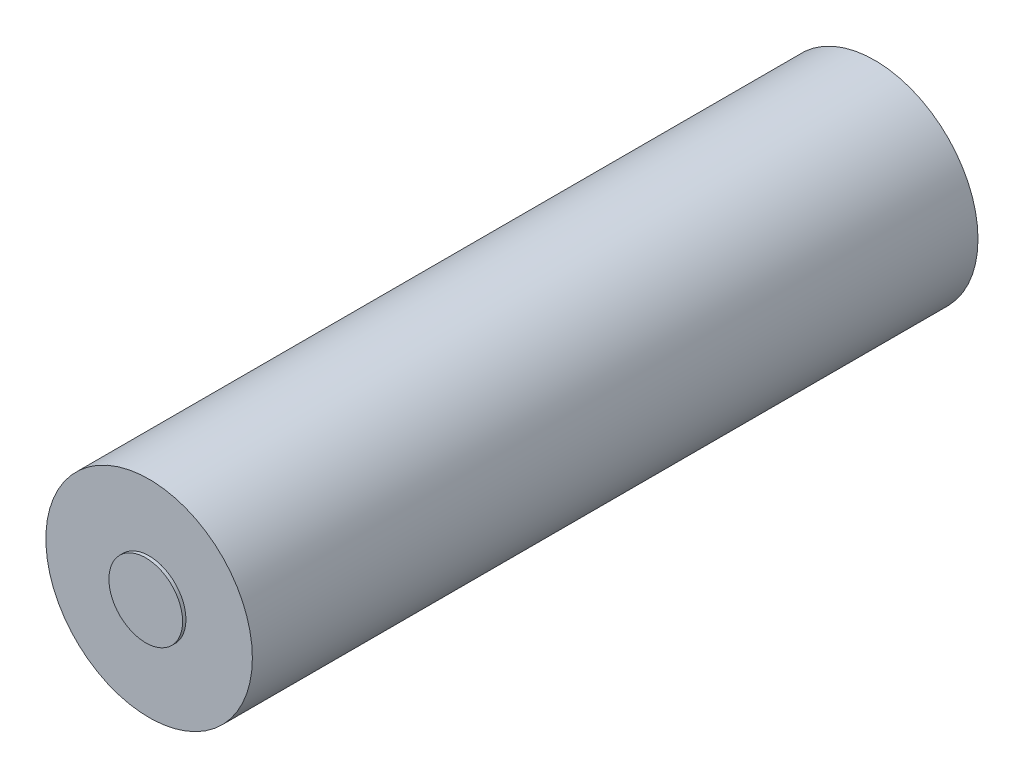
ISO-10303-21;
HEADER;
FILE_DESCRIPTION(('STEP AP214'),'2;1');
FILE_NAME('part.step','',(''),(''),'','','');
FILE_SCHEMA(('AUTOMOTIVE_DESIGN { 1 0 10303 214 1 1 1 1 }'));
ENDSEC;
DATA;
#1=APPLICATION_CONTEXT('core data for automotive mechanical design processes');
#2=APPLICATION_PROTOCOL_DEFINITION('international standard','automotive_design',2000,#1);
#3=PRODUCT_CONTEXT('',#1,'mechanical');
#4=PRODUCT('Part','Part','',(#3));
#5=PRODUCT_RELATED_PRODUCT_CATEGORY('part','',(#4));
#6=PRODUCT_DEFINITION_FORMATION('','',#4);
#7=PRODUCT_DEFINITION_CONTEXT('part definition',#1,'design');
#8=PRODUCT_DEFINITION('design','',#6,#7);
#9=PRODUCT_DEFINITION_SHAPE('','',#8);
#10=(LENGTH_UNIT() NAMED_UNIT(*) SI_UNIT(.MILLI.,.METRE.));
#11=(NAMED_UNIT(*) PLANE_ANGLE_UNIT() SI_UNIT($,.RADIAN.));
#12=(NAMED_UNIT(*) SI_UNIT($,.STERADIAN.) SOLID_ANGLE_UNIT());
#13=UNCERTAINTY_MEASURE_WITH_UNIT(LENGTH_MEASURE(1.E-05),#10,'distance_accuracy_value','');
#14=(GEOMETRIC_REPRESENTATION_CONTEXT(3) GLOBAL_UNCERTAINTY_ASSIGNED_CONTEXT((#13)) GLOBAL_UNIT_ASSIGNED_CONTEXT((#10,
#11,#12)) REPRESENTATION_CONTEXT('',''));
#15=CARTESIAN_POINT('',(0.,0.,0.));
#16=DIRECTION('',(0.,0.,1.));
#17=DIRECTION('',(1.,0.,0.));
#18=AXIS2_PLACEMENT_3D('',#15,#16,#17);
#19=CARTESIAN_POINT('',(0.,0.,65.));
#20=DIRECTION('',(0.,0.,-1.));
#21=DIRECTION('',(-1.,0.,0.));
#22=AXIS2_PLACEMENT_3D('',#19,#20,#21);
#23=CYLINDRICAL_SURFACE('',#22,9.25);
#24=CARTESIAN_POINT('',(0.,0.,65.));
#25=DIRECTION('',(0.,0.,1.));
#26=DIRECTION('',(1.,0.,0.));
#27=AXIS2_PLACEMENT_3D('',#24,#25,#26);
#28=CIRCLE('',#27,9.25);
#29=CARTESIAN_POINT('',(9.25,0.,65.));
#30=VERTEX_POINT('',#29);
#31=EDGE_CURVE('E10',#30,#30,#28,.T.);
#32=ORIENTED_EDGE('',*,*,#31,.F.);
#33=EDGE_LOOP('',(#32));
#34=FACE_BOUND('',#33,.T.);
#35=CARTESIAN_POINT('',(0.,0.,0.));
#36=DIRECTION('',(0.,0.,1.));
#37=DIRECTION('',(1.,0.,0.));
#38=AXIS2_PLACEMENT_3D('',#35,#36,#37);
#39=CIRCLE('',#38,9.25);
#40=CARTESIAN_POINT('',(9.25,0.,0.));
#41=VERTEX_POINT('',#40);
#42=EDGE_CURVE('E34',#41,#41,#39,.T.);
#43=ORIENTED_EDGE('',*,*,#42,.T.);
#44=EDGE_LOOP('',(#43));
#45=FACE_BOUND('',#44,.T.);
#46=ADVANCED_FACE('F31',(#34,#45),#23,.T.);
#47=CARTESIAN_POINT('',(0.,0.,65.));
#48=DIRECTION('',(0.,0.,1.));
#49=DIRECTION('',(1.,0.,0.));
#50=AXIS2_PLACEMENT_3D('',#47,#48,#49);
#51=PLANE('',#50);
#52=CARTESIAN_POINT('',(0.,0.,65.));
#53=DIRECTION('',(0.,0.,1.));
#54=DIRECTION('',(1.,0.,0.));
#55=AXIS2_PLACEMENT_3D('',#52,#53,#54);
#56=CIRCLE('',#55,3.3);
#57=CARTESIAN_POINT('',(3.3,0.,65.));
#58=VERTEX_POINT('',#57);
#59=EDGE_CURVE('E43',#58,#58,#56,.T.);
#60=ORIENTED_EDGE('',*,*,#59,.F.);
#61=EDGE_LOOP('',(#60));
#62=FACE_BOUND('',#61,.T.);
#63=ORIENTED_EDGE('',*,*,#31,.T.);
#64=EDGE_LOOP('',(#63));
#65=FACE_BOUND('',#64,.T.);
#66=ADVANCED_FACE('F58',(#62,#65),#51,.T.);
#67=CARTESIAN_POINT('',(0.,0.,0.));
#68=DIRECTION('',(0.,0.,1.));
#69=DIRECTION('',(1.,0.,0.));
#70=AXIS2_PLACEMENT_3D('',#67,#68,#69);
#71=PLANE('',#70);
#72=ORIENTED_EDGE('',*,*,#42,.F.);
#73=EDGE_LOOP('',(#72));
#74=FACE_BOUND('',#73,.T.);
#75=ADVANCED_FACE('F54',(#74),#71,.F.);
#76=CARTESIAN_POINT('',(0.,0.,65.3));
#77=DIRECTION('',(0.,0.,-1.));
#78=DIRECTION('',(-1.,0.,0.));
#79=AXIS2_PLACEMENT_3D('',#76,#77,#78);
#80=CYLINDRICAL_SURFACE('',#79,3.3);
#81=CARTESIAN_POINT('',(0.,0.,65.3));
#82=DIRECTION('',(0.,0.,1.));
#83=DIRECTION('',(1.,0.,0.));
#84=AXIS2_PLACEMENT_3D('',#81,#82,#83);
#85=CIRCLE('',#84,3.3);
#86=CARTESIAN_POINT('',(3.3,0.,65.3));
#87=VERTEX_POINT('',#86);
#88=EDGE_CURVE('E41',#87,#87,#85,.T.);
#89=ORIENTED_EDGE('',*,*,#88,.F.);
#90=EDGE_LOOP('',(#89));
#91=FACE_BOUND('',#90,.T.);
#92=ORIENTED_EDGE('',*,*,#59,.T.);
#93=EDGE_LOOP('',(#92));
#94=FACE_BOUND('',#93,.T.);
#95=ADVANCED_FACE('F51',(#91,#94),#80,.T.);
#96=CARTESIAN_POINT('',(0.,0.,65.3));
#97=DIRECTION('',(0.,0.,1.));
#98=DIRECTION('',(1.,0.,0.));
#99=AXIS2_PLACEMENT_3D('',#96,#97,#98);
#100=PLANE('',#99);
#101=ORIENTED_EDGE('',*,*,#88,.T.);
#102=EDGE_LOOP('',(#101));
#103=FACE_BOUND('',#102,.T.);
#104=ADVANCED_FACE('F49',(#103),#100,.T.);
#105=CLOSED_SHELL('',(#46,#66,#75,#95,#104));
#106=MANIFOLD_SOLID_BREP('B2',#105);
#107=ADVANCED_BREP_SHAPE_REPRESENTATION('',(#18,#106),#14);
#108=SHAPE_DEFINITION_REPRESENTATION(#9,#107);
ENDSEC;
END-ISO-10303-21;
